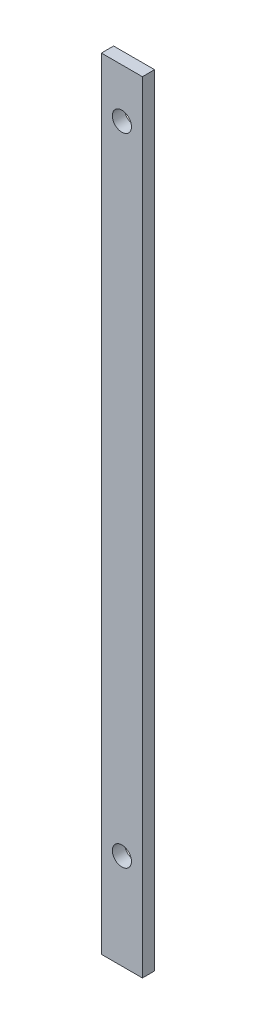
ISO-10303-21;
HEADER;
FILE_DESCRIPTION(('STEP AP214'),'2;1');
FILE_NAME('part.step','',(''),(''),'','','');
FILE_SCHEMA(('AUTOMOTIVE_DESIGN { 1 0 10303 214 1 1 1 1 }'));
ENDSEC;
DATA;
#1=APPLICATION_CONTEXT('core data for automotive mechanical design processes');
#2=APPLICATION_PROTOCOL_DEFINITION('international standard','automotive_design',2000,#1);
#3=PRODUCT_CONTEXT('',#1,'mechanical');
#4=PRODUCT('Part','Part','',(#3));
#5=PRODUCT_RELATED_PRODUCT_CATEGORY('part','',(#4));
#6=PRODUCT_DEFINITION_FORMATION('','',#4);
#7=PRODUCT_DEFINITION_CONTEXT('part definition',#1,'design');
#8=PRODUCT_DEFINITION('design','',#6,#7);
#9=PRODUCT_DEFINITION_SHAPE('','',#8);
#10=(LENGTH_UNIT() NAMED_UNIT(*) SI_UNIT(.MILLI.,.METRE.));
#11=(NAMED_UNIT(*) PLANE_ANGLE_UNIT() SI_UNIT($,.RADIAN.));
#12=(NAMED_UNIT(*) SI_UNIT($,.STERADIAN.) SOLID_ANGLE_UNIT());
#13=UNCERTAINTY_MEASURE_WITH_UNIT(LENGTH_MEASURE(1.E-05),#10,'distance_accuracy_value','');
#14=(GEOMETRIC_REPRESENTATION_CONTEXT(3) GLOBAL_UNCERTAINTY_ASSIGNED_CONTEXT((#13)) GLOBAL_UNIT_ASSIGNED_CONTEXT((#10,
#11,#12)) REPRESENTATION_CONTEXT('',''));
#15=CARTESIAN_POINT('',(0.,0.,0.));
#16=DIRECTION('',(0.,0.,1.));
#17=DIRECTION('',(1.,0.,0.));
#18=AXIS2_PLACEMENT_3D('',#15,#16,#17);
#19=CARTESIAN_POINT('',(0.,0.,3.175));
#20=DIRECTION('',(0.,0.,-1.));
#21=DIRECTION('',(-1.,0.,0.));
#22=AXIS2_PLACEMENT_3D('',#19,#20,#21);
#23=PLANE('',#22);
#24=CARTESIAN_POINT('',(-13.7159999999559,88.9,3.175));
#25=DIRECTION('',(0.,0.,1.));
#26=DIRECTION('',(1.,0.,0.));
#27=AXIS2_PLACEMENT_3D('',#24,#25,#26);
#28=CIRCLE('',#27,2.48919999999999);
#29=CARTESIAN_POINT('',(-11.2267999999559,88.9,3.175));
#30=VERTEX_POINT('',#29);
#31=EDGE_CURVE('E144',#30,#30,#28,.T.);
#32=ORIENTED_EDGE('',*,*,#31,.F.);
#33=EDGE_LOOP('',(#32));
#34=FACE_BOUND('',#33,.T.);
#35=DIRECTION('',(-1.,0.,0.));
#36=VECTOR('',#35,1.);
#37=CARTESIAN_POINT('',(-19.0499999999559,101.6,3.175));
#38=LINE('',#37,#36);
#39=CARTESIAN_POINT('',(-8.38199999995591,101.6,3.175));
#40=VERTEX_POINT('',#39);
#41=CARTESIAN_POINT('',(-19.0499999999559,101.6,3.175));
#42=VERTEX_POINT('',#41);
#43=EDGE_CURVE('E95',#40,#42,#38,.T.);
#44=ORIENTED_EDGE('',*,*,#43,.T.);
#45=DIRECTION('',(0.,-1.,0.));
#46=VECTOR('',#45,1.);
#47=CARTESIAN_POINT('',(-19.0499999999559,101.6,3.175));
#48=LINE('',#47,#46);
#49=CARTESIAN_POINT('',(-19.0499999999559,-101.6,3.175));
#50=VERTEX_POINT('',#49);
#51=EDGE_CURVE('E90',#42,#50,#48,.T.);
#52=ORIENTED_EDGE('',*,*,#51,.T.);
#53=DIRECTION('',(1.,0.,0.));
#54=VECTOR('',#53,1.);
#55=CARTESIAN_POINT('',(-19.0499999999559,-101.6,3.175));
#56=LINE('',#55,#54);
#57=CARTESIAN_POINT('',(-8.38199999995591,-101.6,3.175));
#58=VERTEX_POINT('',#57);
#59=EDGE_CURVE('E93',#50,#58,#56,.T.);
#60=ORIENTED_EDGE('',*,*,#59,.T.);
#61=DIRECTION('',(0.,1.,0.));
#62=VECTOR('',#61,1.);
#63=CARTESIAN_POINT('',(-8.38199999995591,101.6,3.175));
#64=LINE('',#63,#62);
#65=EDGE_CURVE('E60',#58,#40,#64,.T.);
#66=ORIENTED_EDGE('',*,*,#65,.T.);
#67=EDGE_LOOP('',(#44,#52,#60,#66));
#68=FACE_BOUND('',#67,.T.);
#69=CARTESIAN_POINT('',(-13.7159999999559,-76.7542569910273,3.175));
#70=DIRECTION('',(0.,0.,1.));
#71=DIRECTION('',(1.,0.,0.));
#72=AXIS2_PLACEMENT_3D('',#69,#70,#71);
#73=CIRCLE('',#72,2.4892);
#74=CARTESIAN_POINT('',(-11.2267999999559,-76.7542569910273,3.175));
#75=VERTEX_POINT('',#74);
#76=EDGE_CURVE('E136',#75,#75,#73,.T.);
#77=ORIENTED_EDGE('',*,*,#76,.F.);
#78=EDGE_LOOP('',(#77));
#79=FACE_BOUND('',#78,.T.);
#80=ADVANCED_FACE('F42',(#34,#68,#79),#23,.F.);
#81=CARTESIAN_POINT('',(0.,0.,0.));
#82=DIRECTION('',(0.,0.,-1.));
#83=DIRECTION('',(-1.,0.,0.));
#84=AXIS2_PLACEMENT_3D('',#81,#82,#83);
#85=PLANE('',#84);
#86=CARTESIAN_POINT('',(-13.7159999999559,88.9,0.));
#87=DIRECTION('',(0.,0.,1.));
#88=DIRECTION('',(1.,0.,0.));
#89=AXIS2_PLACEMENT_3D('',#86,#87,#88);
#90=CIRCLE('',#89,2.4892);
#91=CARTESIAN_POINT('',(-11.2267999999559,88.9,0.));
#92=VERTEX_POINT('',#91);
#93=EDGE_CURVE('E140',#92,#92,#90,.T.);
#94=ORIENTED_EDGE('',*,*,#93,.T.);
#95=EDGE_LOOP('',(#94));
#96=FACE_BOUND('',#95,.T.);
#97=DIRECTION('',(-1.,0.,0.));
#98=VECTOR('',#97,1.);
#99=CARTESIAN_POINT('',(-19.0499999999559,101.6,0.));
#100=LINE('',#99,#98);
#101=CARTESIAN_POINT('',(-8.38199999995591,101.6,0.));
#102=VERTEX_POINT('',#101);
#103=CARTESIAN_POINT('',(-19.0499999999559,101.6,0.));
#104=VERTEX_POINT('',#103);
#105=EDGE_CURVE('E111',#102,#104,#100,.T.);
#106=ORIENTED_EDGE('',*,*,#105,.F.);
#107=DIRECTION('',(0.,1.,0.));
#108=VECTOR('',#107,1.);
#109=CARTESIAN_POINT('',(-8.38199999995591,101.6,0.));
#110=LINE('',#109,#108);
#111=CARTESIAN_POINT('',(-8.38199999995591,-101.6,0.));
#112=VERTEX_POINT('',#111);
#113=EDGE_CURVE('E83',#112,#102,#110,.T.);
#114=ORIENTED_EDGE('',*,*,#113,.F.);
#115=DIRECTION('',(1.,0.,0.));
#116=VECTOR('',#115,1.);
#117=CARTESIAN_POINT('',(-19.0499999999559,-101.6,0.));
#118=LINE('',#117,#116);
#119=CARTESIAN_POINT('',(-19.0499999999559,-101.6,0.));
#120=VERTEX_POINT('',#119);
#121=EDGE_CURVE('E77',#120,#112,#118,.T.);
#122=ORIENTED_EDGE('',*,*,#121,.F.);
#123=DIRECTION('',(0.,-1.,0.));
#124=VECTOR('',#123,1.);
#125=CARTESIAN_POINT('',(-19.0499999999559,101.6,0.));
#126=LINE('',#125,#124);
#127=EDGE_CURVE('E100',#104,#120,#126,.T.);
#128=ORIENTED_EDGE('',*,*,#127,.F.);
#129=EDGE_LOOP('',(#106,#114,#122,#128));
#130=FACE_BOUND('',#129,.T.);
#131=CARTESIAN_POINT('',(-13.7159999999559,-76.7542569910273,0.));
#132=DIRECTION('',(0.,0.,1.));
#133=DIRECTION('',(1.,0.,0.));
#134=AXIS2_PLACEMENT_3D('',#131,#132,#133);
#135=CIRCLE('',#134,2.4892);
#136=CARTESIAN_POINT('',(-11.2267999999559,-76.7542569910273,0.));
#137=VERTEX_POINT('',#136);
#138=EDGE_CURVE('E115',#137,#137,#135,.T.);
#139=ORIENTED_EDGE('',*,*,#138,.T.);
#140=EDGE_LOOP('',(#139));
#141=FACE_BOUND('',#140,.T.);
#142=ADVANCED_FACE('F128',(#96,#130,#141),#85,.T.);
#143=CARTESIAN_POINT('',(-19.0499999999559,101.6,3.175));
#144=DIRECTION('',(0.,-1.,0.));
#145=DIRECTION('',(0.,0.,-1.));
#146=AXIS2_PLACEMENT_3D('',#143,#144,#145);
#147=PLANE('',#146);
#148=ORIENTED_EDGE('',*,*,#105,.T.);
#149=DIRECTION('',(0.,0.,-1.));
#150=VECTOR('',#149,1.);
#151=CARTESIAN_POINT('',(-19.0499999999559,101.6,3.175));
#152=LINE('',#151,#150);
#153=EDGE_CURVE('E11',#42,#104,#152,.T.);
#154=ORIENTED_EDGE('',*,*,#153,.F.);
#155=ORIENTED_EDGE('',*,*,#43,.F.);
#156=DIRECTION('',(0.,0.,-1.));
#157=VECTOR('',#156,1.);
#158=CARTESIAN_POINT('',(-8.38199999995591,101.6,3.175));
#159=LINE('',#158,#157);
#160=EDGE_CURVE('E107',#40,#102,#159,.T.);
#161=ORIENTED_EDGE('',*,*,#160,.T.);
#162=EDGE_LOOP('',(#148,#154,#155,#161));
#163=FACE_BOUND('',#162,.T.);
#164=ADVANCED_FACE('F44',(#163),#147,.F.);
#165=CARTESIAN_POINT('',(-19.0499999999559,101.6,3.175));
#166=DIRECTION('',(1.,0.,0.));
#167=DIRECTION('',(0.,0.,-1.));
#168=AXIS2_PLACEMENT_3D('',#165,#166,#167);
#169=PLANE('',#168);
#170=ORIENTED_EDGE('',*,*,#127,.T.);
#171=DIRECTION('',(0.,0.,-1.));
#172=VECTOR('',#171,1.);
#173=CARTESIAN_POINT('',(-19.0499999999559,-101.6,3.175));
#174=LINE('',#173,#172);
#175=EDGE_CURVE('E52',#50,#120,#174,.T.);
#176=ORIENTED_EDGE('',*,*,#175,.F.);
#177=ORIENTED_EDGE('',*,*,#51,.F.);
#178=ORIENTED_EDGE('',*,*,#153,.T.);
#179=EDGE_LOOP('',(#170,#176,#177,#178));
#180=FACE_BOUND('',#179,.T.);
#181=ADVANCED_FACE('F99',(#180),#169,.F.);
#182=CARTESIAN_POINT('',(-19.0499999999559,-101.6,3.175));
#183=DIRECTION('',(0.,1.,0.));
#184=DIRECTION('',(0.,0.,1.));
#185=AXIS2_PLACEMENT_3D('',#182,#183,#184);
#186=PLANE('',#185);
#187=ORIENTED_EDGE('',*,*,#121,.T.);
#188=DIRECTION('',(0.,0.,-1.));
#189=VECTOR('',#188,1.);
#190=CARTESIAN_POINT('',(-8.38199999995591,-101.6,3.175));
#191=LINE('',#190,#189);
#192=EDGE_CURVE('E102',#58,#112,#191,.T.);
#193=ORIENTED_EDGE('',*,*,#192,.F.);
#194=ORIENTED_EDGE('',*,*,#59,.F.);
#195=ORIENTED_EDGE('',*,*,#175,.T.);
#196=EDGE_LOOP('',(#187,#193,#194,#195));
#197=FACE_BOUND('',#196,.T.);
#198=ADVANCED_FACE('F103',(#197),#186,.F.);
#199=CARTESIAN_POINT('',(-8.38199999995591,101.6,3.175));
#200=DIRECTION('',(-1.,0.,0.));
#201=DIRECTION('',(0.,0.,1.));
#202=AXIS2_PLACEMENT_3D('',#199,#200,#201);
#203=PLANE('',#202);
#204=ORIENTED_EDGE('',*,*,#113,.T.);
#205=ORIENTED_EDGE('',*,*,#160,.F.);
#206=ORIENTED_EDGE('',*,*,#65,.F.);
#207=ORIENTED_EDGE('',*,*,#192,.T.);
#208=EDGE_LOOP('',(#204,#205,#206,#207));
#209=FACE_BOUND('',#208,.T.);
#210=ADVANCED_FACE('F125',(#209),#203,.F.);
#211=CARTESIAN_POINT('',(-13.7159999999559,-76.7542569910273,3.175));
#212=DIRECTION('',(0.,0.,1.));
#213=DIRECTION('',(1.,0.,0.));
#214=AXIS2_PLACEMENT_3D('',#211,#212,#213);
#215=CYLINDRICAL_SURFACE('',#214,2.4892);
#216=ORIENTED_EDGE('',*,*,#138,.F.);
#217=EDGE_LOOP('',(#216));
#218=FACE_BOUND('',#217,.T.);
#219=ORIENTED_EDGE('',*,*,#76,.T.);
#220=EDGE_LOOP('',(#219));
#221=FACE_BOUND('',#220,.T.);
#222=ADVANCED_FACE('F159',(#218,#221),#215,.F.);
#223=CARTESIAN_POINT('',(-13.7159999999559,88.9,3.175));
#224=DIRECTION('',(0.,0.,1.));
#225=DIRECTION('',(1.,0.,0.));
#226=AXIS2_PLACEMENT_3D('',#223,#224,#225);
#227=CYLINDRICAL_SURFACE('',#226,2.48919999999999);
#228=ORIENTED_EDGE('',*,*,#93,.F.);
#229=EDGE_LOOP('',(#228));
#230=FACE_BOUND('',#229,.T.);
#231=ORIENTED_EDGE('',*,*,#31,.T.);
#232=EDGE_LOOP('',(#231));
#233=FACE_BOUND('',#232,.T.);
#234=ADVANCED_FACE('F149',(#230,#233),#227,.F.);
#235=CLOSED_SHELL('',(#80,#142,#164,#181,#198,#210,#222,#234));
#236=MANIFOLD_SOLID_BREP('B2',#235);
#237=ADVANCED_BREP_SHAPE_REPRESENTATION('',(#18,#236),#14);
#238=SHAPE_DEFINITION_REPRESENTATION(#9,#237);
ENDSEC;
END-ISO-10303-21;
